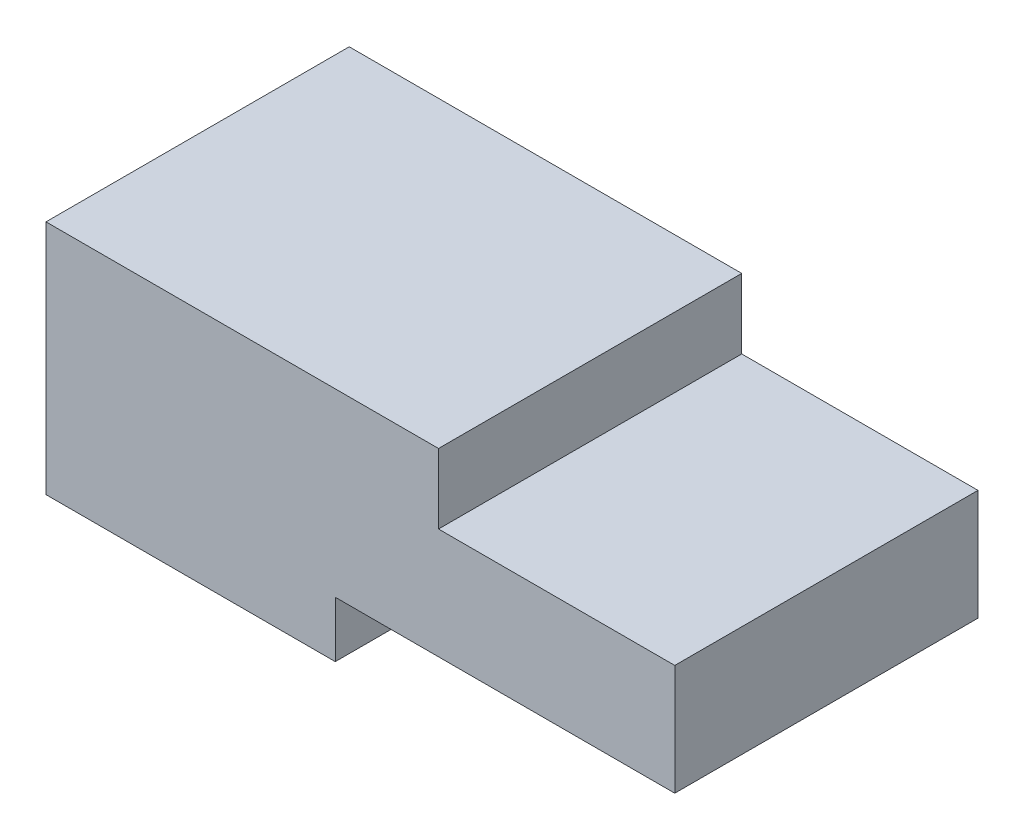
ISO-10303-21;
HEADER;
FILE_DESCRIPTION(('STEP AP214'),'2;1');
FILE_NAME('part.step','',(''),(''),'','','');
FILE_SCHEMA(('AUTOMOTIVE_DESIGN { 1 0 10303 214 1 1 1 1 }'));
ENDSEC;
DATA;
#1=APPLICATION_CONTEXT('core data for automotive mechanical design processes');
#2=APPLICATION_PROTOCOL_DEFINITION('international standard','automotive_design',2000,#1);
#3=PRODUCT_CONTEXT('',#1,'mechanical');
#4=PRODUCT('Part','Part','',(#3));
#5=PRODUCT_RELATED_PRODUCT_CATEGORY('part','',(#4));
#6=PRODUCT_DEFINITION_FORMATION('','',#4);
#7=PRODUCT_DEFINITION_CONTEXT('part definition',#1,'design');
#8=PRODUCT_DEFINITION('design','',#6,#7);
#9=PRODUCT_DEFINITION_SHAPE('','',#8);
#10=(LENGTH_UNIT() NAMED_UNIT(*) SI_UNIT(.MILLI.,.METRE.));
#11=(NAMED_UNIT(*) PLANE_ANGLE_UNIT() SI_UNIT($,.RADIAN.));
#12=(NAMED_UNIT(*) SI_UNIT($,.STERADIAN.) SOLID_ANGLE_UNIT());
#13=UNCERTAINTY_MEASURE_WITH_UNIT(LENGTH_MEASURE(1.E-05),#10,'distance_accuracy_value','');
#14=(GEOMETRIC_REPRESENTATION_CONTEXT(3) GLOBAL_UNCERTAINTY_ASSIGNED_CONTEXT((#13)) GLOBAL_UNIT_ASSIGNED_CONTEXT((#10,
#11,#12)) REPRESENTATION_CONTEXT('',''));
#15=CARTESIAN_POINT('',(0.,0.,0.));
#16=DIRECTION('',(0.,0.,1.));
#17=DIRECTION('',(1.,0.,0.));
#18=AXIS2_PLACEMENT_3D('',#15,#16,#17);
#19=CARTESIAN_POINT('',(0.,-12.7,0.));
#20=DIRECTION('',(-1.,0.,0.));
#21=DIRECTION('',(0.,0.,1.));
#22=AXIS2_PLACEMENT_3D('',#19,#20,#21);
#23=PLANE('',#22);
#24=DIRECTION('',(0.,0.,1.));
#25=VECTOR('',#24,1.);
#26=CARTESIAN_POINT('',(0.,0.,0.));
#27=LINE('',#26,#25);
#28=CARTESIAN_POINT('',(0.,0.,-16.3));
#29=VERTEX_POINT('',#28);
#30=CARTESIAN_POINT('',(0.,0.,0.));
#31=VERTEX_POINT('',#30);
#32=EDGE_CURVE('E126',#29,#31,#27,.T.);
#33=ORIENTED_EDGE('',*,*,#32,.F.);
#34=DIRECTION('',(0.,1.,0.));
#35=VECTOR('',#34,1.);
#36=CARTESIAN_POINT('',(0.,-12.7,-16.3));
#37=LINE('',#36,#35);
#38=CARTESIAN_POINT('',(0.,-12.7,-16.3));
#39=VERTEX_POINT('',#38);
#40=EDGE_CURVE('E11',#39,#29,#37,.T.);
#41=ORIENTED_EDGE('',*,*,#40,.F.);
#42=DIRECTION('',(0.,0.,1.));
#43=VECTOR('',#42,1.);
#44=CARTESIAN_POINT('',(0.,-12.7,0.));
#45=LINE('',#44,#43);
#46=CARTESIAN_POINT('',(0.,-12.7,0.));
#47=VERTEX_POINT('',#46);
#48=EDGE_CURVE('E119',#39,#47,#45,.T.);
#49=ORIENTED_EDGE('',*,*,#48,.T.);
#50=DIRECTION('',(0.,1.,0.));
#51=VECTOR('',#50,1.);
#52=CARTESIAN_POINT('',(0.,-12.7,0.));
#53=LINE('',#52,#51);
#54=EDGE_CURVE('E36',#47,#31,#53,.T.);
#55=ORIENTED_EDGE('',*,*,#54,.T.);
#56=EDGE_LOOP('',(#33,#41,#49,#55));
#57=FACE_BOUND('',#56,.T.);
#58=ADVANCED_FACE('F33',(#57),#23,.T.);
#59=CARTESIAN_POINT('',(0.,-12.7,-16.3));
#60=DIRECTION('',(0.,0.,-1.));
#61=DIRECTION('',(-1.,0.,0.));
#62=AXIS2_PLACEMENT_3D('',#59,#60,#61);
#63=PLANE('',#62);
#64=DIRECTION('',(0.,-1.,0.));
#65=VECTOR('',#64,1.);
#66=CARTESIAN_POINT('',(15.55,-12.7,-16.3));
#67=LINE('',#66,#65);
#68=CARTESIAN_POINT('',(15.55,-9.7,-16.3));
#69=VERTEX_POINT('',#68);
#70=CARTESIAN_POINT('',(15.55,-12.7,-16.3));
#71=VERTEX_POINT('',#70);
#72=EDGE_CURVE('E100',#69,#71,#67,.T.);
#73=ORIENTED_EDGE('',*,*,#72,.T.);
#74=DIRECTION('',(-1.,0.,0.));
#75=VECTOR('',#74,1.);
#76=CARTESIAN_POINT('',(0.,-12.7,-16.3));
#77=LINE('',#76,#75);
#78=EDGE_CURVE('E111',#71,#39,#77,.T.);
#79=ORIENTED_EDGE('',*,*,#78,.T.);
#80=ORIENTED_EDGE('',*,*,#40,.T.);
#81=DIRECTION('',(-1.,0.,0.));
#82=VECTOR('',#81,1.);
#83=CARTESIAN_POINT('',(0.,0.,-16.3));
#84=LINE('',#83,#82);
#85=CARTESIAN_POINT('',(21.1,0.,-16.3));
#86=VERTEX_POINT('',#85);
#87=EDGE_CURVE('E133',#86,#29,#84,.T.);
#88=ORIENTED_EDGE('',*,*,#87,.F.);
#89=DIRECTION('',(0.,-1.,0.));
#90=VECTOR('',#89,1.);
#91=CARTESIAN_POINT('',(21.1,0.,-16.3));
#92=LINE('',#91,#90);
#93=CARTESIAN_POINT('',(21.1,-3.75,-16.3));
#94=VERTEX_POINT('',#93);
#95=EDGE_CURVE('E57',#86,#94,#92,.T.);
#96=ORIENTED_EDGE('',*,*,#95,.T.);
#97=DIRECTION('',(1.,0.,0.));
#98=VECTOR('',#97,1.);
#99=CARTESIAN_POINT('',(21.1,-3.75,-16.3));
#100=LINE('',#99,#98);
#101=CARTESIAN_POINT('',(33.8,-3.75,-16.3));
#102=VERTEX_POINT('',#101);
#103=EDGE_CURVE('E157',#94,#102,#100,.T.);
#104=ORIENTED_EDGE('',*,*,#103,.T.);
#105=DIRECTION('',(0.,1.,0.));
#106=VECTOR('',#105,1.);
#107=CARTESIAN_POINT('',(33.8,-12.7,-16.3));
#108=LINE('',#107,#106);
#109=CARTESIAN_POINT('',(33.8,-9.7,-16.3));
#110=VERTEX_POINT('',#109);
#111=EDGE_CURVE('E41',#110,#102,#108,.T.);
#112=ORIENTED_EDGE('',*,*,#111,.F.);
#113=DIRECTION('',(-1.,0.,0.));
#114=VECTOR('',#113,1.);
#115=CARTESIAN_POINT('',(15.55,-9.7,-16.3));
#116=LINE('',#115,#114);
#117=EDGE_CURVE('E107',#110,#69,#116,.T.);
#118=ORIENTED_EDGE('',*,*,#117,.T.);
#119=EDGE_LOOP('',(#73,#79,#80,#88,#96,#104,#112,#118));
#120=FACE_BOUND('',#119,.T.);
#121=ADVANCED_FACE('F110',(#120),#63,.T.);
#122=CARTESIAN_POINT('',(33.8,-12.7,0.));
#123=DIRECTION('',(1.,0.,0.));
#124=DIRECTION('',(0.,0.,-1.));
#125=AXIS2_PLACEMENT_3D('',#122,#123,#124);
#126=PLANE('',#125);
#127=DIRECTION('',(0.,0.,1.));
#128=VECTOR('',#127,1.);
#129=CARTESIAN_POINT('',(33.8,-9.7,-16.3));
#130=LINE('',#129,#128);
#131=CARTESIAN_POINT('',(33.8,-9.7,0.));
#132=VERTEX_POINT('',#131);
#133=EDGE_CURVE('E106',#110,#132,#130,.T.);
#134=ORIENTED_EDGE('',*,*,#133,.F.);
#135=ORIENTED_EDGE('',*,*,#111,.T.);
#136=DIRECTION('',(0.,0.,1.));
#137=VECTOR('',#136,1.);
#138=CARTESIAN_POINT('',(33.8,-3.75,-16.3));
#139=LINE('',#138,#137);
#140=CARTESIAN_POINT('',(33.8,-3.75,0.));
#141=VERTEX_POINT('',#140);
#142=EDGE_CURVE('E149',#102,#141,#139,.T.);
#143=ORIENTED_EDGE('',*,*,#142,.T.);
#144=DIRECTION('',(0.,1.,0.));
#145=VECTOR('',#144,1.);
#146=CARTESIAN_POINT('',(33.8,-12.7,0.));
#147=LINE('',#146,#145);
#148=EDGE_CURVE('E122',#132,#141,#147,.T.);
#149=ORIENTED_EDGE('',*,*,#148,.F.);
#150=EDGE_LOOP('',(#134,#135,#143,#149));
#151=FACE_BOUND('',#150,.T.);
#152=ADVANCED_FACE('F148',(#151),#126,.T.);
#153=CARTESIAN_POINT('',(0.,-12.7,0.));
#154=DIRECTION('',(0.,0.,1.));
#155=DIRECTION('',(1.,0.,0.));
#156=AXIS2_PLACEMENT_3D('',#153,#154,#155);
#157=PLANE('',#156);
#158=DIRECTION('',(0.,-1.,0.));
#159=VECTOR('',#158,1.);
#160=CARTESIAN_POINT('',(15.55,-12.7,0.));
#161=LINE('',#160,#159);
#162=CARTESIAN_POINT('',(15.55,-9.7,0.));
#163=VERTEX_POINT('',#162);
#164=CARTESIAN_POINT('',(15.55,-12.7,0.));
#165=VERTEX_POINT('',#164);
#166=EDGE_CURVE('E49',#163,#165,#161,.T.);
#167=ORIENTED_EDGE('',*,*,#166,.F.);
#168=DIRECTION('',(-1.,0.,0.));
#169=VECTOR('',#168,1.);
#170=CARTESIAN_POINT('',(15.55,-9.7,0.));
#171=LINE('',#170,#169);
#172=EDGE_CURVE('E114',#132,#163,#171,.T.);
#173=ORIENTED_EDGE('',*,*,#172,.F.);
#174=ORIENTED_EDGE('',*,*,#148,.T.);
#175=DIRECTION('',(1.,0.,0.));
#176=VECTOR('',#175,1.);
#177=CARTESIAN_POINT('',(21.1,-3.75,0.));
#178=LINE('',#177,#176);
#179=CARTESIAN_POINT('',(21.1,-3.75,0.));
#180=VERTEX_POINT('',#179);
#181=EDGE_CURVE('E143',#180,#141,#178,.T.);
#182=ORIENTED_EDGE('',*,*,#181,.F.);
#183=DIRECTION('',(0.,-1.,0.));
#184=VECTOR('',#183,1.);
#185=CARTESIAN_POINT('',(21.1,0.,0.));
#186=LINE('',#185,#184);
#187=CARTESIAN_POINT('',(21.1,0.,0.));
#188=VERTEX_POINT('',#187);
#189=EDGE_CURVE('E168',#188,#180,#186,.T.);
#190=ORIENTED_EDGE('',*,*,#189,.F.);
#191=DIRECTION('',(1.,0.,0.));
#192=VECTOR('',#191,1.);
#193=CARTESIAN_POINT('',(0.,0.,0.));
#194=LINE('',#193,#192);
#195=EDGE_CURVE('E129',#31,#188,#194,.T.);
#196=ORIENTED_EDGE('',*,*,#195,.F.);
#197=ORIENTED_EDGE('',*,*,#54,.F.);
#198=DIRECTION('',(1.,0.,0.));
#199=VECTOR('',#198,1.);
#200=CARTESIAN_POINT('',(0.,-12.7,0.));
#201=LINE('',#200,#199);
#202=EDGE_CURVE('E120',#47,#165,#201,.T.);
#203=ORIENTED_EDGE('',*,*,#202,.T.);
#204=EDGE_LOOP('',(#167,#173,#174,#182,#190,#196,#197,#203));
#205=FACE_BOUND('',#204,.T.);
#206=ADVANCED_FACE('F141',(#205),#157,.T.);
#207=CARTESIAN_POINT('',(0.,-12.7,0.));
#208=DIRECTION('',(0.,-1.,0.));
#209=DIRECTION('',(0.,0.,-1.));
#210=AXIS2_PLACEMENT_3D('',#207,#208,#209);
#211=PLANE('',#210);
#212=DIRECTION('',(0.,0.,1.));
#213=VECTOR('',#212,1.);
#214=CARTESIAN_POINT('',(15.55,-12.7,-16.3));
#215=LINE('',#214,#213);
#216=EDGE_CURVE('E97',#71,#165,#215,.T.);
#217=ORIENTED_EDGE('',*,*,#216,.T.);
#218=ORIENTED_EDGE('',*,*,#202,.F.);
#219=ORIENTED_EDGE('',*,*,#48,.F.);
#220=ORIENTED_EDGE('',*,*,#78,.F.);
#221=EDGE_LOOP('',(#217,#218,#219,#220));
#222=FACE_BOUND('',#221,.T.);
#223=ADVANCED_FACE('F117',(#222),#211,.T.);
#224=CARTESIAN_POINT('',(0.,0.,0.));
#225=DIRECTION('',(0.,-1.,0.));
#226=DIRECTION('',(0.,0.,-1.));
#227=AXIS2_PLACEMENT_3D('',#224,#225,#226);
#228=PLANE('',#227);
#229=ORIENTED_EDGE('',*,*,#195,.T.);
#230=DIRECTION('',(0.,0.,1.));
#231=VECTOR('',#230,1.);
#232=CARTESIAN_POINT('',(21.1,0.,-16.3));
#233=LINE('',#232,#231);
#234=EDGE_CURVE('E153',#86,#188,#233,.T.);
#235=ORIENTED_EDGE('',*,*,#234,.F.);
#236=ORIENTED_EDGE('',*,*,#87,.T.);
#237=ORIENTED_EDGE('',*,*,#32,.T.);
#238=EDGE_LOOP('',(#229,#235,#236,#237));
#239=FACE_BOUND('',#238,.T.);
#240=ADVANCED_FACE('F165',(#239),#228,.F.);
#241=CARTESIAN_POINT('',(21.1,0.,-16.3));
#242=DIRECTION('',(-1.,0.,0.));
#243=DIRECTION('',(0.,0.,1.));
#244=AXIS2_PLACEMENT_3D('',#241,#242,#243);
#245=PLANE('',#244);
#246=ORIENTED_EDGE('',*,*,#189,.T.);
#247=DIRECTION('',(0.,0.,1.));
#248=VECTOR('',#247,1.);
#249=CARTESIAN_POINT('',(21.1,-3.75,-16.3));
#250=LINE('',#249,#248);
#251=EDGE_CURVE('E154',#94,#180,#250,.T.);
#252=ORIENTED_EDGE('',*,*,#251,.F.);
#253=ORIENTED_EDGE('',*,*,#95,.F.);
#254=ORIENTED_EDGE('',*,*,#234,.T.);
#255=EDGE_LOOP('',(#246,#252,#253,#254));
#256=FACE_BOUND('',#255,.T.);
#257=ADVANCED_FACE('F167',(#256),#245,.F.);
#258=CARTESIAN_POINT('',(21.1,-3.75,-16.3));
#259=DIRECTION('',(0.,-1.,0.));
#260=DIRECTION('',(0.,0.,-1.));
#261=AXIS2_PLACEMENT_3D('',#258,#259,#260);
#262=PLANE('',#261);
#263=ORIENTED_EDGE('',*,*,#181,.T.);
#264=ORIENTED_EDGE('',*,*,#142,.F.);
#265=ORIENTED_EDGE('',*,*,#103,.F.);
#266=ORIENTED_EDGE('',*,*,#251,.T.);
#267=EDGE_LOOP('',(#263,#264,#265,#266));
#268=FACE_BOUND('',#267,.T.);
#269=ADVANCED_FACE('F184',(#268),#262,.F.);
#270=CARTESIAN_POINT('',(15.55,-12.7,-16.3));
#271=DIRECTION('',(-1.,0.,0.));
#272=DIRECTION('',(0.,0.,1.));
#273=AXIS2_PLACEMENT_3D('',#270,#271,#272);
#274=PLANE('',#273);
#275=ORIENTED_EDGE('',*,*,#166,.T.);
#276=ORIENTED_EDGE('',*,*,#216,.F.);
#277=ORIENTED_EDGE('',*,*,#72,.F.);
#278=DIRECTION('',(0.,0.,1.));
#279=VECTOR('',#278,1.);
#280=CARTESIAN_POINT('',(15.55,-9.7,-16.3));
#281=LINE('',#280,#279);
#282=EDGE_CURVE('E130',#69,#163,#281,.T.);
#283=ORIENTED_EDGE('',*,*,#282,.T.);
#284=EDGE_LOOP('',(#275,#276,#277,#283));
#285=FACE_BOUND('',#284,.T.);
#286=ADVANCED_FACE('F99',(#285),#274,.F.);
#287=CARTESIAN_POINT('',(15.55,-9.7,-16.3));
#288=DIRECTION('',(0.,1.,0.));
#289=DIRECTION('',(0.,0.,1.));
#290=AXIS2_PLACEMENT_3D('',#287,#288,#289);
#291=PLANE('',#290);
#292=ORIENTED_EDGE('',*,*,#172,.T.);
#293=ORIENTED_EDGE('',*,*,#282,.F.);
#294=ORIENTED_EDGE('',*,*,#117,.F.);
#295=ORIENTED_EDGE('',*,*,#133,.T.);
#296=EDGE_LOOP('',(#292,#293,#294,#295));
#297=FACE_BOUND('',#296,.T.);
#298=ADVANCED_FACE('F178',(#297),#291,.F.);
#299=CLOSED_SHELL('',(#58,#121,#152,#206,#223,#240,#257,#269,#286,#298));
#300=MANIFOLD_SOLID_BREP('B2',#299);
#301=ADVANCED_BREP_SHAPE_REPRESENTATION('',(#18,#300),#14);
#302=SHAPE_DEFINITION_REPRESENTATION(#9,#301);
ENDSEC;
END-ISO-10303-21;
